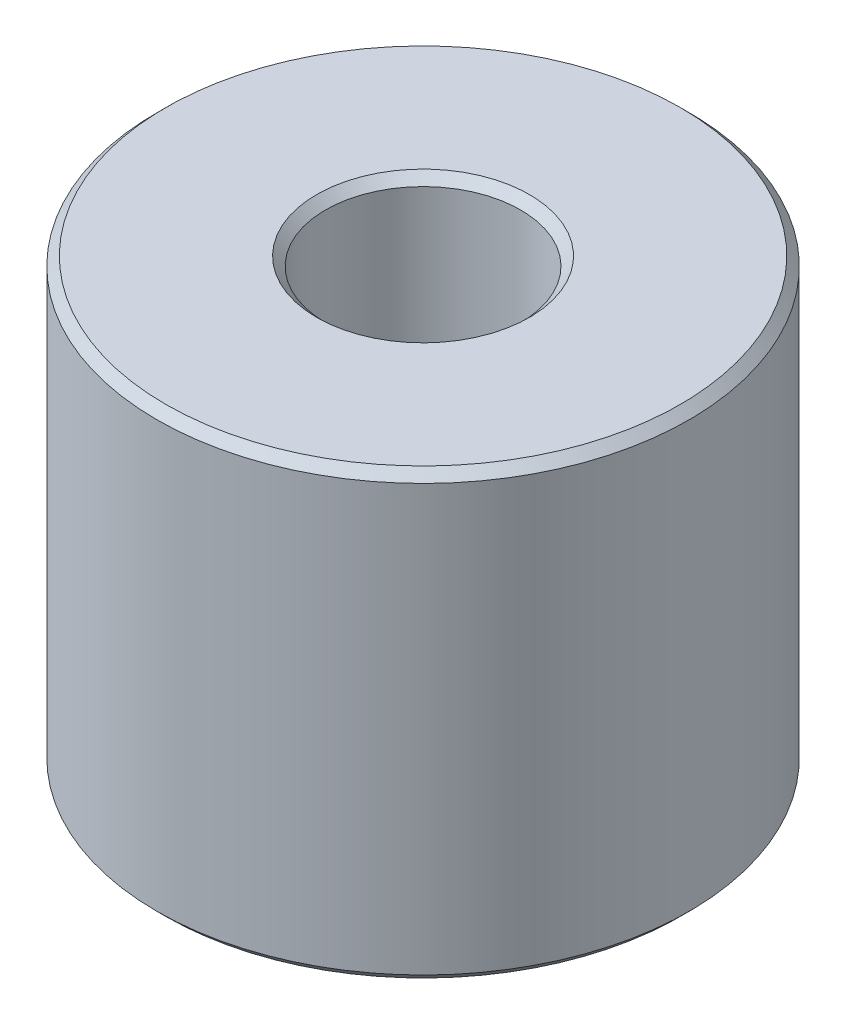
ISO-10303-21;
HEADER;
FILE_DESCRIPTION(('STEP AP214'),'2;1');
FILE_NAME('part.step','',(''),(''),'','','');
FILE_SCHEMA(('AUTOMOTIVE_DESIGN { 1 0 10303 214 1 1 1 1 }'));
ENDSEC;
DATA;
#1=APPLICATION_CONTEXT('core data for automotive mechanical design processes');
#2=APPLICATION_PROTOCOL_DEFINITION('international standard','automotive_design',2000,#1);
#3=PRODUCT_CONTEXT('',#1,'mechanical');
#4=PRODUCT('Part','Part','',(#3));
#5=PRODUCT_RELATED_PRODUCT_CATEGORY('part','',(#4));
#6=PRODUCT_DEFINITION_FORMATION('','',#4);
#7=PRODUCT_DEFINITION_CONTEXT('part definition',#1,'design');
#8=PRODUCT_DEFINITION('design','',#6,#7);
#9=PRODUCT_DEFINITION_SHAPE('','',#8);
#10=(LENGTH_UNIT() NAMED_UNIT(*) SI_UNIT(.MILLI.,.METRE.));
#11=(NAMED_UNIT(*) PLANE_ANGLE_UNIT() SI_UNIT($,.RADIAN.));
#12=(NAMED_UNIT(*) SI_UNIT($,.STERADIAN.) SOLID_ANGLE_UNIT());
#13=UNCERTAINTY_MEASURE_WITH_UNIT(LENGTH_MEASURE(1.E-05),#10,'distance_accuracy_value','');
#14=(GEOMETRIC_REPRESENTATION_CONTEXT(3) GLOBAL_UNCERTAINTY_ASSIGNED_CONTEXT((#13)) GLOBAL_UNIT_ASSIGNED_CONTEXT((#10,
#11,#12)) REPRESENTATION_CONTEXT('',''));
#15=CARTESIAN_POINT('',(0.,0.,0.));
#16=DIRECTION('',(0.,0.,1.));
#17=DIRECTION('',(1.,0.,0.));
#18=AXIS2_PLACEMENT_3D('',#15,#16,#17);
#19=CARTESIAN_POINT('',(0.,2.5,0.));
#20=DIRECTION('',(0.,1.,0.));
#21=DIRECTION('',(0.,0.,1.));
#22=AXIS2_PLACEMENT_3D('',#19,#20,#21);
#23=PLANE('',#22);
#24=CARTESIAN_POINT('',(0.,2.5,0.));
#25=DIRECTION('',(0.,1.,0.));
#26=DIRECTION('',(0.,0.,1.));
#27=AXIS2_PLACEMENT_3D('',#24,#25,#26);
#28=CIRCLE('',#27,2.9);
#29=CARTESIAN_POINT('',(0.,2.5,2.9));
#30=VERTEX_POINT('',#29);
#31=EDGE_CURVE('E52',#30,#30,#28,.T.);
#32=ORIENTED_EDGE('',*,*,#31,.T.);
#33=EDGE_LOOP('',(#32));
#34=FACE_BOUND('',#33,.T.);
#35=CARTESIAN_POINT('',(0.,2.5,0.));
#36=DIRECTION('',(0.,1.,0.));
#37=DIRECTION('',(0.,0.,1.));
#38=AXIS2_PLACEMENT_3D('',#35,#36,#37);
#39=CIRCLE('',#38,1.2);
#40=CARTESIAN_POINT('',(0.,2.5,1.2));
#41=VERTEX_POINT('',#40);
#42=EDGE_CURVE('E56',#41,#41,#39,.F.);
#43=ORIENTED_EDGE('',*,*,#42,.T.);
#44=EDGE_LOOP('',(#43));
#45=FACE_BOUND('',#44,.T.);
#46=ADVANCED_FACE('F40',(#34,#45),#23,.T.);
#47=CARTESIAN_POINT('',(0.,-2.5,0.));
#48=DIRECTION('',(0.,1.,0.));
#49=DIRECTION('',(0.,0.,1.));
#50=AXIS2_PLACEMENT_3D('',#47,#48,#49);
#51=PLANE('',#50);
#52=CARTESIAN_POINT('',(0.,-2.5,0.));
#53=DIRECTION('',(0.,1.,0.));
#54=DIRECTION('',(0.,0.,1.));
#55=AXIS2_PLACEMENT_3D('',#52,#53,#54);
#56=CIRCLE('',#55,2.9);
#57=CARTESIAN_POINT('',(0.,-2.5,2.9));
#58=VERTEX_POINT('',#57);
#59=EDGE_CURVE('E61',#58,#58,#56,.F.);
#60=ORIENTED_EDGE('',*,*,#59,.T.);
#61=EDGE_LOOP('',(#60));
#62=FACE_BOUND('',#61,.T.);
#63=CARTESIAN_POINT('',(0.,-2.5,0.));
#64=DIRECTION('',(0.,1.,0.));
#65=DIRECTION('',(0.,0.,1.));
#66=AXIS2_PLACEMENT_3D('',#63,#64,#65);
#67=CIRCLE('',#66,1.2);
#68=CARTESIAN_POINT('',(0.,-2.5,1.2));
#69=VERTEX_POINT('',#68);
#70=EDGE_CURVE('E64',#69,#69,#67,.T.);
#71=ORIENTED_EDGE('',*,*,#70,.T.);
#72=EDGE_LOOP('',(#71));
#73=FACE_BOUND('',#72,.T.);
#74=ADVANCED_FACE('F86',(#62,#73),#51,.F.);
#75=CARTESIAN_POINT('',(0.,2.5,0.));
#76=DIRECTION('',(0.,-1.,0.));
#77=DIRECTION('',(0.,0.,-1.));
#78=AXIS2_PLACEMENT_3D('',#75,#76,#77);
#79=CYLINDRICAL_SURFACE('',#78,3.);
#80=CARTESIAN_POINT('',(0.,-2.4,0.));
#81=DIRECTION('',(0.,1.,0.));
#82=DIRECTION('',(0.,0.,1.));
#83=AXIS2_PLACEMENT_3D('',#80,#81,#82);
#84=CIRCLE('',#83,3.);
#85=CARTESIAN_POINT('',(0.,-2.4,3.));
#86=VERTEX_POINT('',#85);
#87=EDGE_CURVE('E67',#86,#86,#84,.T.);
#88=ORIENTED_EDGE('',*,*,#87,.T.);
#89=EDGE_LOOP('',(#88));
#90=FACE_BOUND('',#89,.T.);
#91=CARTESIAN_POINT('',(0.,2.4,0.));
#92=DIRECTION('',(0.,1.,0.));
#93=DIRECTION('',(0.,0.,1.));
#94=AXIS2_PLACEMENT_3D('',#91,#92,#93);
#95=CIRCLE('',#94,3.);
#96=CARTESIAN_POINT('',(0.,2.4,3.));
#97=VERTEX_POINT('',#96);
#98=EDGE_CURVE('E70',#97,#97,#95,.F.);
#99=ORIENTED_EDGE('',*,*,#98,.T.);
#100=EDGE_LOOP('',(#99));
#101=FACE_BOUND('',#100,.T.);
#102=ADVANCED_FACE('F74',(#90,#101),#79,.T.);
#103=CARTESIAN_POINT('',(0.,2.5,0.));
#104=DIRECTION('',(0.,-1.,0.));
#105=DIRECTION('',(0.,0.,-1.));
#106=AXIS2_PLACEMENT_3D('',#103,#104,#105);
#107=CYLINDRICAL_SURFACE('',#106,1.1);
#108=CARTESIAN_POINT('',(0.,-2.4,0.));
#109=DIRECTION('',(0.,1.,0.));
#110=DIRECTION('',(0.,0.,1.));
#111=AXIS2_PLACEMENT_3D('',#108,#109,#110);
#112=CIRCLE('',#111,1.1);
#113=CARTESIAN_POINT('',(0.,-2.4,1.1));
#114=VERTEX_POINT('',#113);
#115=EDGE_CURVE('E10',#114,#114,#112,.F.);
#116=ORIENTED_EDGE('',*,*,#115,.T.);
#117=EDGE_LOOP('',(#116));
#118=FACE_BOUND('',#117,.T.);
#119=CARTESIAN_POINT('',(0.,2.4,0.));
#120=DIRECTION('',(0.,1.,0.));
#121=DIRECTION('',(0.,0.,1.));
#122=AXIS2_PLACEMENT_3D('',#119,#120,#121);
#123=CIRCLE('',#122,1.1);
#124=CARTESIAN_POINT('',(0.,2.4,1.1));
#125=VERTEX_POINT('',#124);
#126=EDGE_CURVE('E48',#125,#125,#123,.T.);
#127=ORIENTED_EDGE('',*,*,#126,.T.);
#128=EDGE_LOOP('',(#127));
#129=FACE_BOUND('',#128,.T.);
#130=ADVANCED_FACE('F111',(#118,#129),#107,.F.);
#131=CARTESIAN_POINT('',(0.,-2.4,0.));
#132=DIRECTION('',(0.,1.,0.));
#133=DIRECTION('',(0.,0.,1.));
#134=AXIS2_PLACEMENT_3D('',#131,#132,#133);
#135=CONICAL_SURFACE('',#134,3.,0.785398163397455);
#136=ORIENTED_EDGE('',*,*,#59,.F.);
#137=EDGE_LOOP('',(#136));
#138=FACE_BOUND('',#137,.T.);
#139=ORIENTED_EDGE('',*,*,#87,.F.);
#140=EDGE_LOOP('',(#139));
#141=FACE_BOUND('',#140,.T.);
#142=ADVANCED_FACE('F80',(#138,#141),#135,.T.);
#143=CARTESIAN_POINT('',(0.,2.5,0.));
#144=DIRECTION('',(0.,-1.,0.));
#145=DIRECTION('',(0.,0.,-1.));
#146=AXIS2_PLACEMENT_3D('',#143,#144,#145);
#147=CONICAL_SURFACE('',#146,2.9,0.785398163397448);
#148=ORIENTED_EDGE('',*,*,#98,.F.);
#149=EDGE_LOOP('',(#148));
#150=FACE_BOUND('',#149,.T.);
#151=ORIENTED_EDGE('',*,*,#31,.F.);
#152=EDGE_LOOP('',(#151));
#153=FACE_BOUND('',#152,.T.);
#154=ADVANCED_FACE('F76',(#150,#153),#147,.T.);
#155=CARTESIAN_POINT('',(0.,-2.5,0.));
#156=DIRECTION('',(0.,-1.,0.));
#157=DIRECTION('',(0.,0.,-1.));
#158=AXIS2_PLACEMENT_3D('',#155,#156,#157);
#159=CONICAL_SURFACE('',#158,1.2,0.785398163397445);
#160=ORIENTED_EDGE('',*,*,#115,.F.);
#161=EDGE_LOOP('',(#160));
#162=FACE_BOUND('',#161,.T.);
#163=ORIENTED_EDGE('',*,*,#70,.F.);
#164=EDGE_LOOP('',(#163));
#165=FACE_BOUND('',#164,.T.);
#166=ADVANCED_FACE('F79',(#162,#165),#159,.F.);
#167=CARTESIAN_POINT('',(0.,2.4,0.));
#168=DIRECTION('',(0.,1.,0.));
#169=DIRECTION('',(0.,0.,1.));
#170=AXIS2_PLACEMENT_3D('',#167,#168,#169);
#171=CONICAL_SURFACE('',#170,1.1,0.785398163397449);
#172=ORIENTED_EDGE('',*,*,#42,.F.);
#173=EDGE_LOOP('',(#172));
#174=FACE_BOUND('',#173,.T.);
#175=ORIENTED_EDGE('',*,*,#126,.F.);
#176=EDGE_LOOP('',(#175));
#177=FACE_BOUND('',#176,.T.);
#178=ADVANCED_FACE('F43',(#174,#177),#171,.F.);
#179=CLOSED_SHELL('',(#46,#74,#102,#130,#142,#154,#166,#178));
#180=MANIFOLD_SOLID_BREP('B2',#179);
#181=ADVANCED_BREP_SHAPE_REPRESENTATION('',(#18,#180),#14);
#182=SHAPE_DEFINITION_REPRESENTATION(#9,#181);
ENDSEC;
END-ISO-10303-21;
